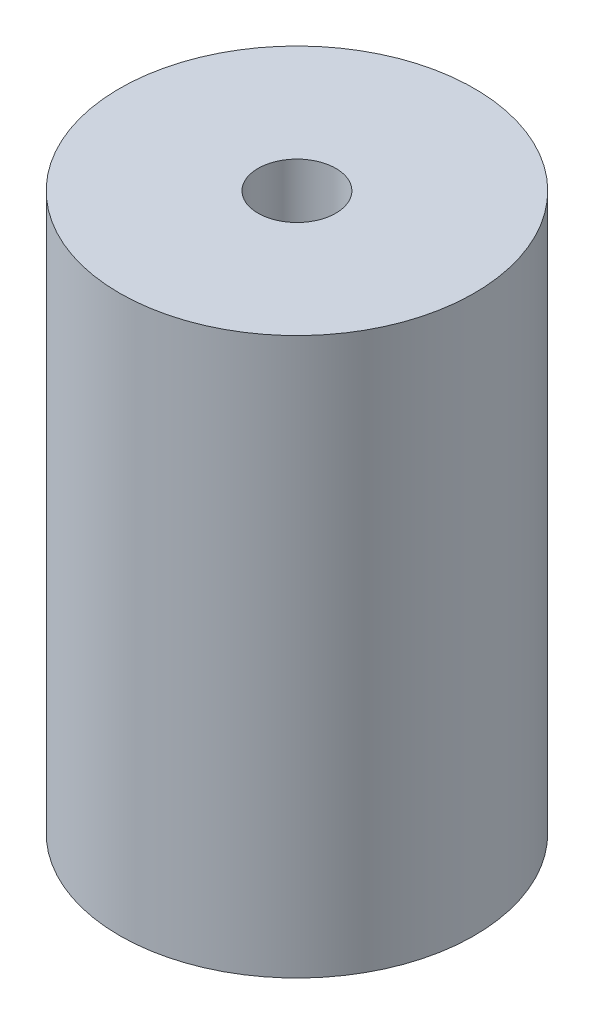
ISO-10303-21;
HEADER;
FILE_DESCRIPTION(('STEP AP214'),'2;1');
FILE_NAME('part.step','',(''),(''),'','','');
FILE_SCHEMA(('AUTOMOTIVE_DESIGN { 1 0 10303 214 1 1 1 1 }'));
ENDSEC;
DATA;
#1=APPLICATION_CONTEXT('core data for automotive mechanical design processes');
#2=APPLICATION_PROTOCOL_DEFINITION('international standard','automotive_design',2000,#1);
#3=PRODUCT_CONTEXT('',#1,'mechanical');
#4=PRODUCT('Part','Part','',(#3));
#5=PRODUCT_RELATED_PRODUCT_CATEGORY('part','',(#4));
#6=PRODUCT_DEFINITION_FORMATION('','',#4);
#7=PRODUCT_DEFINITION_CONTEXT('part definition',#1,'design');
#8=PRODUCT_DEFINITION('design','',#6,#7);
#9=PRODUCT_DEFINITION_SHAPE('','',#8);
#10=(LENGTH_UNIT() NAMED_UNIT(*) SI_UNIT(.MILLI.,.METRE.));
#11=(NAMED_UNIT(*) PLANE_ANGLE_UNIT() SI_UNIT($,.RADIAN.));
#12=(NAMED_UNIT(*) SI_UNIT($,.STERADIAN.) SOLID_ANGLE_UNIT());
#13=UNCERTAINTY_MEASURE_WITH_UNIT(LENGTH_MEASURE(1.E-05),#10,'distance_accuracy_value','');
#14=(GEOMETRIC_REPRESENTATION_CONTEXT(3) GLOBAL_UNCERTAINTY_ASSIGNED_CONTEXT((#13)) GLOBAL_UNIT_ASSIGNED_CONTEXT((#10,
#11,#12)) REPRESENTATION_CONTEXT('',''));
#15=CARTESIAN_POINT('',(0.,0.,0.));
#16=DIRECTION('',(0.,0.,1.));
#17=DIRECTION('',(1.,0.,0.));
#18=AXIS2_PLACEMENT_3D('',#15,#16,#17);
#19=CARTESIAN_POINT('',(0.,-3.,0.));
#20=DIRECTION('',(0.,1.,0.));
#21=DIRECTION('',(0.,0.,1.));
#22=AXIS2_PLACEMENT_3D('',#19,#20,#21);
#23=CYLINDRICAL_SURFACE('',#22,1.39816513761468);
#24=CARTESIAN_POINT('',(0.,-3.,0.));
#25=DIRECTION('',(0.,1.,0.));
#26=DIRECTION('',(0.,0.,1.));
#27=AXIS2_PLACEMENT_3D('',#24,#25,#26);
#28=CIRCLE('',#27,1.39816513761468);
#29=CARTESIAN_POINT('',(0.,-3.,1.39816513761468));
#30=VERTEX_POINT('',#29);
#31=EDGE_CURVE('E47',#30,#30,#28,.T.);
#32=ORIENTED_EDGE('',*,*,#31,.F.);
#33=EDGE_LOOP('',(#32));
#34=FACE_BOUND('',#33,.T.);
#35=CARTESIAN_POINT('',(0.,0.,0.));
#36=DIRECTION('',(0.,1.,0.));
#37=DIRECTION('',(0.,0.,1.));
#38=AXIS2_PLACEMENT_3D('',#35,#36,#37);
#39=CIRCLE('',#38,1.39816513761468);
#40=CARTESIAN_POINT('',(0.,0.,1.39816513761468));
#41=VERTEX_POINT('',#40);
#42=EDGE_CURVE('E53',#41,#41,#39,.T.);
#43=ORIENTED_EDGE('',*,*,#42,.T.);
#44=EDGE_LOOP('',(#43));
#45=FACE_BOUND('',#44,.T.);
#46=ADVANCED_FACE('F40',(#34,#45),#23,.F.);
#47=CARTESIAN_POINT('',(0.,-3.,0.));
#48=DIRECTION('',(0.,1.,0.));
#49=DIRECTION('',(0.,0.,1.));
#50=AXIS2_PLACEMENT_3D('',#47,#48,#49);
#51=CYLINDRICAL_SURFACE('',#50,6.375);
#52=CARTESIAN_POINT('',(0.,-3.,0.));
#53=DIRECTION('',(0.,1.,0.));
#54=DIRECTION('',(0.,0.,1.));
#55=AXIS2_PLACEMENT_3D('',#52,#53,#54);
#56=CIRCLE('',#55,6.375);
#57=CARTESIAN_POINT('',(0.,-3.,6.375));
#58=VERTEX_POINT('',#57);
#59=EDGE_CURVE('E11',#58,#58,#56,.T.);
#60=ORIENTED_EDGE('',*,*,#59,.T.);
#61=EDGE_LOOP('',(#60));
#62=FACE_BOUND('',#61,.T.);
#63=CARTESIAN_POINT('',(0.,0.,0.));
#64=DIRECTION('',(0.,1.,0.));
#65=DIRECTION('',(0.,0.,1.));
#66=AXIS2_PLACEMENT_3D('',#63,#64,#65);
#67=CIRCLE('',#66,6.375);
#68=CARTESIAN_POINT('',(0.,0.,6.375));
#69=VERTEX_POINT('',#68);
#70=EDGE_CURVE('E43',#69,#69,#67,.T.);
#71=ORIENTED_EDGE('',*,*,#70,.F.);
#72=EDGE_LOOP('',(#71));
#73=FACE_BOUND('',#72,.T.);
#74=ADVANCED_FACE('F62',(#62,#73),#51,.T.);
#75=CARTESIAN_POINT('',(0.,-3.,0.));
#76=DIRECTION('',(0.,1.,0.));
#77=DIRECTION('',(0.,0.,1.));
#78=AXIS2_PLACEMENT_3D('',#75,#76,#77);
#79=PLANE('',#78);
#80=ORIENTED_EDGE('',*,*,#31,.T.);
#81=EDGE_LOOP('',(#80));
#82=FACE_BOUND('',#81,.T.);
#83=ORIENTED_EDGE('',*,*,#59,.F.);
#84=EDGE_LOOP('',(#83));
#85=FACE_BOUND('',#84,.T.);
#86=ADVANCED_FACE('F64',(#82,#85),#79,.F.);
#87=CARTESIAN_POINT('',(0.,0.,0.));
#88=DIRECTION('',(0.,1.,0.));
#89=DIRECTION('',(0.,0.,1.));
#90=AXIS2_PLACEMENT_3D('',#87,#88,#89);
#91=PLANE('',#90);
#92=ORIENTED_EDGE('',*,*,#42,.F.);
#93=EDGE_LOOP('',(#92));
#94=FACE_BOUND('',#93,.T.);
#95=ORIENTED_EDGE('',*,*,#70,.T.);
#96=EDGE_LOOP('',(#95));
#97=FACE_BOUND('',#96,.T.);
#98=ADVANCED_FACE('F60',(#94,#97),#91,.T.);
#99=CLOSED_SHELL('',(#46,#74,#86,#98));
#100=MANIFOLD_SOLID_BREP('B2',#99);
#101=CARTESIAN_POINT('',(0.,-3.,0.));
#102=DIRECTION('',(0.,1.,0.));
#103=DIRECTION('',(0.,0.,1.));
#104=AXIS2_PLACEMENT_3D('',#101,#102,#103);
#105=CYLINDRICAL_SURFACE('',#104,1.39816513761468);
#106=CARTESIAN_POINT('',(0.,-3.,0.));
#107=DIRECTION('',(0.,1.,0.));
#108=DIRECTION('',(0.,0.,1.));
#109=AXIS2_PLACEMENT_3D('',#106,#107,#108);
#110=CIRCLE('',#109,1.39816513761468);
#111=CARTESIAN_POINT('',(0.,-3.,1.39816513761468));
#112=VERTEX_POINT('',#111);
#113=EDGE_CURVE('E110',#112,#112,#110,.T.);
#114=ORIENTED_EDGE('',*,*,#113,.F.);
#115=EDGE_LOOP('',(#114));
#116=FACE_BOUND('',#115,.T.);
#117=CARTESIAN_POINT('',(0.,17.,0.));
#118=DIRECTION('',(0.,1.,0.));
#119=DIRECTION('',(0.,0.,1.));
#120=AXIS2_PLACEMENT_3D('',#117,#118,#119);
#121=CIRCLE('',#120,1.39816513761468);
#122=CARTESIAN_POINT('',(0.,17.,1.39816513761468));
#123=VERTEX_POINT('',#122);
#124=EDGE_CURVE('E118',#123,#123,#121,.T.);
#125=ORIENTED_EDGE('',*,*,#124,.T.);
#126=EDGE_LOOP('',(#125));
#127=FACE_BOUND('',#126,.T.);
#128=ADVANCED_FACE('F104',(#116,#127),#105,.F.);
#129=CARTESIAN_POINT('',(0.,-3.,0.));
#130=DIRECTION('',(0.,1.,0.));
#131=DIRECTION('',(0.,0.,1.));
#132=AXIS2_PLACEMENT_3D('',#129,#130,#131);
#133=CYLINDRICAL_SURFACE('',#132,6.375);
#134=CARTESIAN_POINT('',(0.,-3.,0.));
#135=DIRECTION('',(0.,1.,0.));
#136=DIRECTION('',(0.,0.,1.));
#137=AXIS2_PLACEMENT_3D('',#134,#135,#136);
#138=CIRCLE('',#137,6.375);
#139=CARTESIAN_POINT('',(0.,-3.,6.375));
#140=VERTEX_POINT('',#139);
#141=EDGE_CURVE('E39',#140,#140,#138,.T.);
#142=ORIENTED_EDGE('',*,*,#141,.T.);
#143=EDGE_LOOP('',(#142));
#144=FACE_BOUND('',#143,.T.);
#145=CARTESIAN_POINT('',(0.,17.,0.));
#146=DIRECTION('',(0.,1.,0.));
#147=DIRECTION('',(0.,0.,1.));
#148=AXIS2_PLACEMENT_3D('',#145,#146,#147);
#149=CIRCLE('',#148,6.375);
#150=CARTESIAN_POINT('',(0.,17.,6.375));
#151=VERTEX_POINT('',#150);
#152=EDGE_CURVE('E114',#151,#151,#149,.T.);
#153=ORIENTED_EDGE('',*,*,#152,.F.);
#154=EDGE_LOOP('',(#153));
#155=FACE_BOUND('',#154,.T.);
#156=ADVANCED_FACE('F132',(#144,#155),#133,.T.);
#157=CARTESIAN_POINT('',(0.,-3.,0.));
#158=DIRECTION('',(0.,1.,0.));
#159=DIRECTION('',(0.,0.,1.));
#160=AXIS2_PLACEMENT_3D('',#157,#158,#159);
#161=PLANE('',#160);
#162=ORIENTED_EDGE('',*,*,#113,.T.);
#163=EDGE_LOOP('',(#162));
#164=FACE_BOUND('',#163,.T.);
#165=ORIENTED_EDGE('',*,*,#141,.F.);
#166=EDGE_LOOP('',(#165));
#167=FACE_BOUND('',#166,.T.);
#168=ADVANCED_FACE('F128',(#164,#167),#161,.F.);
#169=CARTESIAN_POINT('',(0.,17.,0.));
#170=DIRECTION('',(0.,1.,0.));
#171=DIRECTION('',(0.,0.,1.));
#172=AXIS2_PLACEMENT_3D('',#169,#170,#171);
#173=PLANE('',#172);
#174=ORIENTED_EDGE('',*,*,#124,.F.);
#175=EDGE_LOOP('',(#174));
#176=FACE_BOUND('',#175,.T.);
#177=ORIENTED_EDGE('',*,*,#152,.T.);
#178=EDGE_LOOP('',(#177));
#179=FACE_BOUND('',#178,.T.);
#180=ADVANCED_FACE('F125',(#176,#179),#173,.T.);
#181=CLOSED_SHELL('',(#128,#156,#168,#180));
#182=MANIFOLD_SOLID_BREP('B6',#181);
#183=ADVANCED_BREP_SHAPE_REPRESENTATION('',(#18,#100,#182),#14);
#184=SHAPE_DEFINITION_REPRESENTATION(#9,#183);
ENDSEC;
END-ISO-10303-21;
